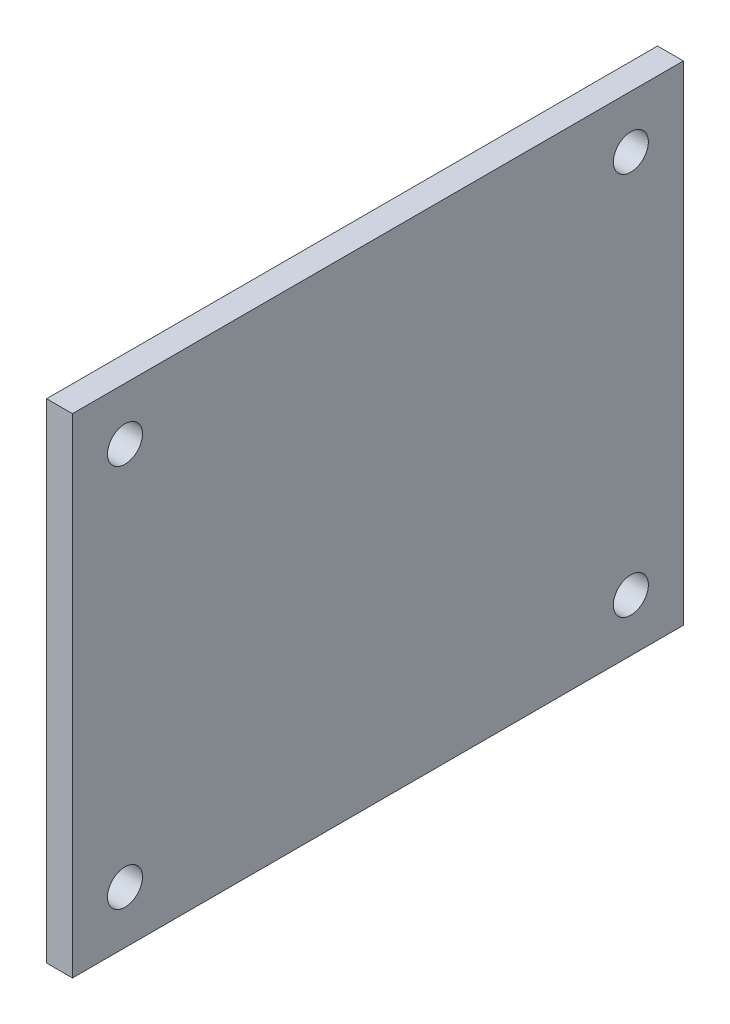
ISO-10303-21;
HEADER;
FILE_DESCRIPTION(('STEP AP214'),'2;1');
FILE_NAME('part.step','',(''),(''),'','','');
FILE_SCHEMA(('AUTOMOTIVE_DESIGN { 1 0 10303 214 1 1 1 1 }'));
ENDSEC;
DATA;
#1=APPLICATION_CONTEXT('core data for automotive mechanical design processes');
#2=APPLICATION_PROTOCOL_DEFINITION('international standard','automotive_design',2000,#1);
#3=PRODUCT_CONTEXT('',#1,'mechanical');
#4=PRODUCT('Part','Part','',(#3));
#5=PRODUCT_RELATED_PRODUCT_CATEGORY('part','',(#4));
#6=PRODUCT_DEFINITION_FORMATION('','',#4);
#7=PRODUCT_DEFINITION_CONTEXT('part definition',#1,'design');
#8=PRODUCT_DEFINITION('design','',#6,#7);
#9=PRODUCT_DEFINITION_SHAPE('','',#8);
#10=(LENGTH_UNIT() NAMED_UNIT(*) SI_UNIT(.MILLI.,.METRE.));
#11=(NAMED_UNIT(*) PLANE_ANGLE_UNIT() SI_UNIT($,.RADIAN.));
#12=(NAMED_UNIT(*) SI_UNIT($,.STERADIAN.) SOLID_ANGLE_UNIT());
#13=UNCERTAINTY_MEASURE_WITH_UNIT(LENGTH_MEASURE(1.E-05),#10,'distance_accuracy_value','');
#14=(GEOMETRIC_REPRESENTATION_CONTEXT(3) GLOBAL_UNCERTAINTY_ASSIGNED_CONTEXT((#13)) GLOBAL_UNIT_ASSIGNED_CONTEXT((#10,
#11,#12)) REPRESENTATION_CONTEXT('',''));
#15=CARTESIAN_POINT('',(0.,0.,0.));
#16=DIRECTION('',(0.,0.,1.));
#17=DIRECTION('',(1.,0.,0.));
#18=AXIS2_PLACEMENT_3D('',#15,#16,#17);
#19=CARTESIAN_POINT('',(-1.5875,-30.,-37.5));
#20=DIRECTION('',(0.,0.,-1.));
#21=DIRECTION('',(-1.,0.,0.));
#22=AXIS2_PLACEMENT_3D('',#19,#20,#21);
#23=PLANE('',#22);
#24=DIRECTION('',(1.,0.,0.));
#25=VECTOR('',#24,1.);
#26=CARTESIAN_POINT('',(-1.5875,30.,-37.5));
#27=LINE('',#26,#25);
#28=CARTESIAN_POINT('',(-1.5875,30.,-37.5));
#29=VERTEX_POINT('',#28);
#30=CARTESIAN_POINT('',(1.5875,30.,-37.5));
#31=VERTEX_POINT('',#30);
#32=EDGE_CURVE('E42',#29,#31,#27,.T.);
#33=ORIENTED_EDGE('',*,*,#32,.T.);
#34=DIRECTION('',(0.,1.,0.));
#35=VECTOR('',#34,1.);
#36=CARTESIAN_POINT('',(1.5875,-30.,-37.5));
#37=LINE('',#36,#35);
#38=CARTESIAN_POINT('',(1.5875,-30.,-37.5));
#39=VERTEX_POINT('',#38);
#40=EDGE_CURVE('E80',#39,#31,#37,.T.);
#41=ORIENTED_EDGE('',*,*,#40,.F.);
#42=DIRECTION('',(1.,0.,0.));
#43=VECTOR('',#42,1.);
#44=CARTESIAN_POINT('',(-1.5875,-30.,-37.5));
#45=LINE('',#44,#43);
#46=CARTESIAN_POINT('',(-1.5875,-30.,-37.5));
#47=VERTEX_POINT('',#46);
#48=EDGE_CURVE('E11',#47,#39,#45,.T.);
#49=ORIENTED_EDGE('',*,*,#48,.F.);
#50=DIRECTION('',(0.,1.,0.));
#51=VECTOR('',#50,1.);
#52=CARTESIAN_POINT('',(-1.5875,-30.,-37.5));
#53=LINE('',#52,#51);
#54=EDGE_CURVE('E81',#47,#29,#53,.T.);
#55=ORIENTED_EDGE('',*,*,#54,.T.);
#56=EDGE_LOOP('',(#33,#41,#49,#55));
#57=FACE_BOUND('',#56,.T.);
#58=ADVANCED_FACE('F39',(#57),#23,.T.);
#59=CARTESIAN_POINT('',(-1.5875,-30.,37.5));
#60=DIRECTION('',(0.,-1.,0.));
#61=DIRECTION('',(0.,0.,-1.));
#62=AXIS2_PLACEMENT_3D('',#59,#60,#61);
#63=PLANE('',#62);
#64=ORIENTED_EDGE('',*,*,#48,.T.);
#65=DIRECTION('',(0.,0.,-1.));
#66=VECTOR('',#65,1.);
#67=CARTESIAN_POINT('',(1.5875,-30.,37.5));
#68=LINE('',#67,#66);
#69=CARTESIAN_POINT('',(1.5875,-30.,37.5));
#70=VERTEX_POINT('',#69);
#71=EDGE_CURVE('E99',#70,#39,#68,.T.);
#72=ORIENTED_EDGE('',*,*,#71,.F.);
#73=DIRECTION('',(1.,0.,0.));
#74=VECTOR('',#73,1.);
#75=CARTESIAN_POINT('',(-1.5875,-30.,37.5));
#76=LINE('',#75,#74);
#77=CARTESIAN_POINT('',(-1.5875,-30.,37.5));
#78=VERTEX_POINT('',#77);
#79=EDGE_CURVE('E48',#78,#70,#76,.T.);
#80=ORIENTED_EDGE('',*,*,#79,.F.);
#81=DIRECTION('',(0.,0.,-1.));
#82=VECTOR('',#81,1.);
#83=CARTESIAN_POINT('',(-1.5875,-30.,37.5));
#84=LINE('',#83,#82);
#85=EDGE_CURVE('E87',#78,#47,#84,.T.);
#86=ORIENTED_EDGE('',*,*,#85,.T.);
#87=EDGE_LOOP('',(#64,#72,#80,#86));
#88=FACE_BOUND('',#87,.T.);
#89=ADVANCED_FACE('F129',(#88),#63,.T.);
#90=CARTESIAN_POINT('',(-1.5875,-30.,37.5));
#91=DIRECTION('',(0.,0.,1.));
#92=DIRECTION('',(1.,0.,0.));
#93=AXIS2_PLACEMENT_3D('',#90,#91,#92);
#94=PLANE('',#93);
#95=ORIENTED_EDGE('',*,*,#79,.T.);
#96=DIRECTION('',(0.,-1.,0.));
#97=VECTOR('',#96,1.);
#98=CARTESIAN_POINT('',(1.5875,-30.,37.5));
#99=LINE('',#98,#97);
#100=CARTESIAN_POINT('',(1.5875,30.,37.5));
#101=VERTEX_POINT('',#100);
#102=EDGE_CURVE('E95',#101,#70,#99,.T.);
#103=ORIENTED_EDGE('',*,*,#102,.F.);
#104=DIRECTION('',(1.,0.,0.));
#105=VECTOR('',#104,1.);
#106=CARTESIAN_POINT('',(-1.5875,30.,37.5));
#107=LINE('',#106,#105);
#108=CARTESIAN_POINT('',(-1.5875,30.,37.5));
#109=VERTEX_POINT('',#108);
#110=EDGE_CURVE('E86',#109,#101,#107,.T.);
#111=ORIENTED_EDGE('',*,*,#110,.F.);
#112=DIRECTION('',(0.,-1.,0.));
#113=VECTOR('',#112,1.);
#114=CARTESIAN_POINT('',(-1.5875,-30.,37.5));
#115=LINE('',#114,#113);
#116=EDGE_CURVE('E118',#109,#78,#115,.T.);
#117=ORIENTED_EDGE('',*,*,#116,.T.);
#118=EDGE_LOOP('',(#95,#103,#111,#117));
#119=FACE_BOUND('',#118,.T.);
#120=ADVANCED_FACE('F126',(#119),#94,.T.);
#121=CARTESIAN_POINT('',(-1.5875,30.,37.5));
#122=DIRECTION('',(0.,1.,0.));
#123=DIRECTION('',(0.,0.,1.));
#124=AXIS2_PLACEMENT_3D('',#121,#122,#123);
#125=PLANE('',#124);
#126=ORIENTED_EDGE('',*,*,#110,.T.);
#127=DIRECTION('',(0.,0.,1.));
#128=VECTOR('',#127,1.);
#129=CARTESIAN_POINT('',(1.5875,30.,37.5));
#130=LINE('',#129,#128);
#131=EDGE_CURVE('E89',#31,#101,#130,.T.);
#132=ORIENTED_EDGE('',*,*,#131,.F.);
#133=ORIENTED_EDGE('',*,*,#32,.F.);
#134=DIRECTION('',(0.,0.,1.));
#135=VECTOR('',#134,1.);
#136=CARTESIAN_POINT('',(-1.5875,30.,37.5));
#137=LINE('',#136,#135);
#138=EDGE_CURVE('E115',#29,#109,#137,.T.);
#139=ORIENTED_EDGE('',*,*,#138,.T.);
#140=EDGE_LOOP('',(#126,#132,#133,#139));
#141=FACE_BOUND('',#140,.T.);
#142=ADVANCED_FACE('F90',(#141),#125,.T.);
#143=CARTESIAN_POINT('',(-1.5875,0.,0.));
#144=DIRECTION('',(-1.,0.,0.));
#145=DIRECTION('',(0.,0.,1.));
#146=AXIS2_PLACEMENT_3D('',#143,#144,#145);
#147=PLANE('',#146);
#148=CARTESIAN_POINT('',(-1.5875,-23.55,31.05));
#149=DIRECTION('',(1.,0.,0.));
#150=DIRECTION('',(0.,0.,1.));
#151=AXIS2_PLACEMENT_3D('',#148,#149,#150);
#152=CIRCLE('',#151,2.15);
#153=CARTESIAN_POINT('',(-1.5875,-23.55,33.2));
#154=VERTEX_POINT('',#153);
#155=EDGE_CURVE('E214',#154,#154,#152,.T.);
#156=ORIENTED_EDGE('',*,*,#155,.T.);
#157=EDGE_LOOP('',(#156));
#158=FACE_BOUND('',#157,.T.);
#159=CARTESIAN_POINT('',(-1.5875,-23.55,-31.05));
#160=DIRECTION('',(1.,0.,0.));
#161=DIRECTION('',(0.,0.,-1.));
#162=AXIS2_PLACEMENT_3D('',#159,#160,#161);
#163=CIRCLE('',#162,2.15);
#164=CARTESIAN_POINT('',(-1.5875,-23.55,-33.2));
#165=VERTEX_POINT('',#164);
#166=EDGE_CURVE('E224',#165,#165,#163,.T.);
#167=ORIENTED_EDGE('',*,*,#166,.T.);
#168=EDGE_LOOP('',(#167));
#169=FACE_BOUND('',#168,.T.);
#170=CARTESIAN_POINT('',(-1.5875,23.55,-31.05));
#171=DIRECTION('',(1.,0.,0.));
#172=DIRECTION('',(0.,0.,1.));
#173=AXIS2_PLACEMENT_3D('',#170,#171,#172);
#174=CIRCLE('',#173,2.15);
#175=CARTESIAN_POINT('',(-1.5875,23.55,-28.9));
#176=VERTEX_POINT('',#175);
#177=EDGE_CURVE('E228',#176,#176,#174,.T.);
#178=ORIENTED_EDGE('',*,*,#177,.T.);
#179=EDGE_LOOP('',(#178));
#180=FACE_BOUND('',#179,.T.);
#181=CARTESIAN_POINT('',(-1.5875,23.55,31.05));
#182=DIRECTION('',(1.,0.,0.));
#183=DIRECTION('',(0.,0.,-1.));
#184=AXIS2_PLACEMENT_3D('',#181,#182,#183);
#185=CIRCLE('',#184,2.15);
#186=CARTESIAN_POINT('',(-1.5875,23.55,28.9));
#187=VERTEX_POINT('',#186);
#188=EDGE_CURVE('E101',#187,#187,#185,.T.);
#189=ORIENTED_EDGE('',*,*,#188,.T.);
#190=EDGE_LOOP('',(#189));
#191=FACE_BOUND('',#190,.T.);
#192=ORIENTED_EDGE('',*,*,#54,.F.);
#193=ORIENTED_EDGE('',*,*,#85,.F.);
#194=ORIENTED_EDGE('',*,*,#116,.F.);
#195=ORIENTED_EDGE('',*,*,#138,.F.);
#196=EDGE_LOOP('',(#192,#193,#194,#195));
#197=FACE_BOUND('',#196,.T.);
#198=ADVANCED_FACE('F131',(#158,#169,#180,#191,#197),#147,.T.);
#199=CARTESIAN_POINT('',(1.5875,0.,0.));
#200=DIRECTION('',(-1.,0.,0.));
#201=DIRECTION('',(0.,0.,1.));
#202=AXIS2_PLACEMENT_3D('',#199,#200,#201);
#203=PLANE('',#202);
#204=CARTESIAN_POINT('',(1.5875,-23.55,31.05));
#205=DIRECTION('',(1.,0.,0.));
#206=DIRECTION('',(0.,0.,1.));
#207=AXIS2_PLACEMENT_3D('',#204,#205,#206);
#208=CIRCLE('',#207,2.15);
#209=CARTESIAN_POINT('',(1.5875,-23.55,33.2));
#210=VERTEX_POINT('',#209);
#211=EDGE_CURVE('E217',#210,#210,#208,.T.);
#212=ORIENTED_EDGE('',*,*,#211,.F.);
#213=EDGE_LOOP('',(#212));
#214=FACE_BOUND('',#213,.T.);
#215=CARTESIAN_POINT('',(1.5875,-23.55,-31.05));
#216=DIRECTION('',(1.,0.,0.));
#217=DIRECTION('',(0.,0.,-1.));
#218=AXIS2_PLACEMENT_3D('',#215,#216,#217);
#219=CIRCLE('',#218,2.15);
#220=CARTESIAN_POINT('',(1.5875,-23.55,-33.2));
#221=VERTEX_POINT('',#220);
#222=EDGE_CURVE('E221',#221,#221,#219,.T.);
#223=ORIENTED_EDGE('',*,*,#222,.F.);
#224=EDGE_LOOP('',(#223));
#225=FACE_BOUND('',#224,.T.);
#226=CARTESIAN_POINT('',(1.5875,23.55,-31.05));
#227=DIRECTION('',(1.,0.,0.));
#228=DIRECTION('',(0.,0.,1.));
#229=AXIS2_PLACEMENT_3D('',#226,#227,#228);
#230=CIRCLE('',#229,2.15);
#231=CARTESIAN_POINT('',(1.5875,23.55,-28.9));
#232=VERTEX_POINT('',#231);
#233=EDGE_CURVE('E233',#232,#232,#230,.T.);
#234=ORIENTED_EDGE('',*,*,#233,.F.);
#235=EDGE_LOOP('',(#234));
#236=FACE_BOUND('',#235,.T.);
#237=CARTESIAN_POINT('',(1.5875,23.55,31.05));
#238=DIRECTION('',(1.,0.,0.));
#239=DIRECTION('',(0.,0.,-1.));
#240=AXIS2_PLACEMENT_3D('',#237,#238,#239);
#241=CIRCLE('',#240,2.15);
#242=CARTESIAN_POINT('',(1.5875,23.55,28.9));
#243=VERTEX_POINT('',#242);
#244=EDGE_CURVE('E105',#243,#243,#241,.T.);
#245=ORIENTED_EDGE('',*,*,#244,.F.);
#246=EDGE_LOOP('',(#245));
#247=FACE_BOUND('',#246,.T.);
#248=ORIENTED_EDGE('',*,*,#40,.T.);
#249=ORIENTED_EDGE('',*,*,#131,.T.);
#250=ORIENTED_EDGE('',*,*,#102,.T.);
#251=ORIENTED_EDGE('',*,*,#71,.T.);
#252=EDGE_LOOP('',(#248,#249,#250,#251));
#253=FACE_BOUND('',#252,.T.);
#254=ADVANCED_FACE('F98',(#214,#225,#236,#247,#253),#203,.F.);
#255=CARTESIAN_POINT('',(-1.5875,23.55,31.05));
#256=DIRECTION('',(1.,0.,0.));
#257=DIRECTION('',(0.,0.,-1.));
#258=AXIS2_PLACEMENT_3D('',#255,#256,#257);
#259=CYLINDRICAL_SURFACE('',#258,2.15);
#260=ORIENTED_EDGE('',*,*,#188,.F.);
#261=EDGE_LOOP('',(#260));
#262=FACE_BOUND('',#261,.T.);
#263=ORIENTED_EDGE('',*,*,#244,.T.);
#264=EDGE_LOOP('',(#263));
#265=FACE_BOUND('',#264,.T.);
#266=ADVANCED_FACE('F139',(#262,#265),#259,.F.);
#267=CARTESIAN_POINT('',(-1.5875,23.55,-31.05));
#268=DIRECTION('',(1.,0.,0.));
#269=DIRECTION('',(0.,0.,-1.));
#270=AXIS2_PLACEMENT_3D('',#267,#268,#269);
#271=CYLINDRICAL_SURFACE('',#270,2.15);
#272=ORIENTED_EDGE('',*,*,#177,.F.);
#273=EDGE_LOOP('',(#272));
#274=FACE_BOUND('',#273,.T.);
#275=ORIENTED_EDGE('',*,*,#233,.T.);
#276=EDGE_LOOP('',(#275));
#277=FACE_BOUND('',#276,.T.);
#278=ADVANCED_FACE('F178',(#274,#277),#271,.F.);
#279=CARTESIAN_POINT('',(-1.5875,-23.55,-31.05));
#280=DIRECTION('',(1.,0.,0.));
#281=DIRECTION('',(0.,0.,-1.));
#282=AXIS2_PLACEMENT_3D('',#279,#280,#281);
#283=CYLINDRICAL_SURFACE('',#282,2.15);
#284=ORIENTED_EDGE('',*,*,#166,.F.);
#285=EDGE_LOOP('',(#284));
#286=FACE_BOUND('',#285,.T.);
#287=ORIENTED_EDGE('',*,*,#222,.T.);
#288=EDGE_LOOP('',(#287));
#289=FACE_BOUND('',#288,.T.);
#290=ADVANCED_FACE('F188',(#286,#289),#283,.F.);
#291=CARTESIAN_POINT('',(-1.5875,-23.55,31.05));
#292=DIRECTION('',(1.,0.,0.));
#293=DIRECTION('',(0.,0.,-1.));
#294=AXIS2_PLACEMENT_3D('',#291,#292,#293);
#295=CYLINDRICAL_SURFACE('',#294,2.15);
#296=ORIENTED_EDGE('',*,*,#155,.F.);
#297=EDGE_LOOP('',(#296));
#298=FACE_BOUND('',#297,.T.);
#299=ORIENTED_EDGE('',*,*,#211,.T.);
#300=EDGE_LOOP('',(#299));
#301=FACE_BOUND('',#300,.T.);
#302=ADVANCED_FACE('F198',(#298,#301),#295,.F.);
#303=CLOSED_SHELL('',(#58,#89,#120,#142,#198,#254,#266,#278,#290,#302));
#304=MANIFOLD_SOLID_BREP('B2',#303);
#305=ADVANCED_BREP_SHAPE_REPRESENTATION('',(#18,#304),#14);
#306=SHAPE_DEFINITION_REPRESENTATION(#9,#305);
ENDSEC;
END-ISO-10303-21;
